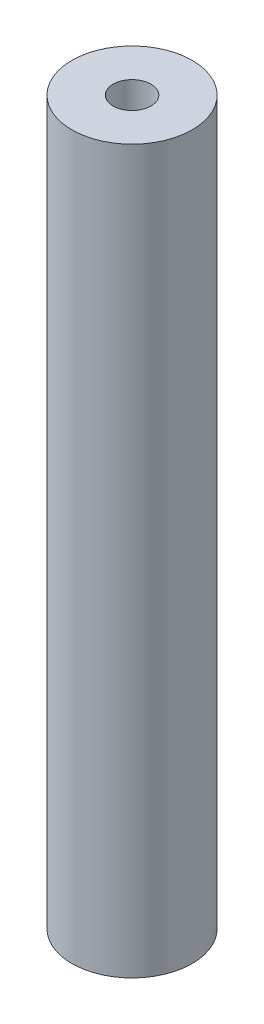
ISO-10303-21;
HEADER;
FILE_DESCRIPTION(('STEP AP214'),'2;1');
FILE_NAME('part.step','',(''),(''),'','','');
FILE_SCHEMA(('AUTOMOTIVE_DESIGN { 1 0 10303 214 1 1 1 1 }'));
ENDSEC;
DATA;
#1=APPLICATION_CONTEXT('core data for automotive mechanical design processes');
#2=APPLICATION_PROTOCOL_DEFINITION('international standard','automotive_design',2000,#1);
#3=PRODUCT_CONTEXT('',#1,'mechanical');
#4=PRODUCT('Part','Part','',(#3));
#5=PRODUCT_RELATED_PRODUCT_CATEGORY('part','',(#4));
#6=PRODUCT_DEFINITION_FORMATION('','',#4);
#7=PRODUCT_DEFINITION_CONTEXT('part definition',#1,'design');
#8=PRODUCT_DEFINITION('design','',#6,#7);
#9=PRODUCT_DEFINITION_SHAPE('','',#8);
#10=(LENGTH_UNIT() NAMED_UNIT(*) SI_UNIT(.MILLI.,.METRE.));
#11=(NAMED_UNIT(*) PLANE_ANGLE_UNIT() SI_UNIT($,.RADIAN.));
#12=(NAMED_UNIT(*) SI_UNIT($,.STERADIAN.) SOLID_ANGLE_UNIT());
#13=UNCERTAINTY_MEASURE_WITH_UNIT(LENGTH_MEASURE(1.E-05),#10,'distance_accuracy_value','');
#14=(GEOMETRIC_REPRESENTATION_CONTEXT(3) GLOBAL_UNCERTAINTY_ASSIGNED_CONTEXT((#13)) GLOBAL_UNIT_ASSIGNED_CONTEXT((#10,
#11,#12)) REPRESENTATION_CONTEXT('',''));
#15=CARTESIAN_POINT('',(0.,0.,0.));
#16=DIRECTION('',(0.,0.,1.));
#17=DIRECTION('',(1.,0.,0.));
#18=AXIS2_PLACEMENT_3D('',#15,#16,#17);
#19=CARTESIAN_POINT('',(0.,76.2,0.));
#20=DIRECTION('',(0.,-1.,0.));
#21=DIRECTION('',(0.,0.,-1.));
#22=AXIS2_PLACEMENT_3D('',#19,#20,#21);
#23=CYLINDRICAL_SURFACE('',#22,6.35);
#24=CARTESIAN_POINT('',(0.,76.2,0.));
#25=DIRECTION('',(0.,1.,0.));
#26=DIRECTION('',(0.,0.,1.));
#27=AXIS2_PLACEMENT_3D('',#24,#25,#26);
#28=CIRCLE('',#27,6.35);
#29=CARTESIAN_POINT('',(0.,76.2,-6.35));
#30=VERTEX_POINT('',#29);
#31=EDGE_CURVE('E10',#30,#30,#28,.T.);
#32=CARTESIAN_POINT('',(0.,0.,0.));
#33=DIRECTION('',(0.,1.,0.));
#34=DIRECTION('',(0.,0.,1.));
#35=AXIS2_PLACEMENT_3D('',#32,#33,#34);
#36=CIRCLE('',#35,6.35);
#37=CARTESIAN_POINT('',(0.,0.,-6.35));
#38=VERTEX_POINT('',#37);
#39=EDGE_CURVE('E40',#38,#38,#36,.T.);
#40=CARTESIAN_POINT('',(0.,76.2,-6.35));
#41=CARTESIAN_POINT('',(0.,75.40625,-6.35));
#42=CARTESIAN_POINT('',(0.,74.6125,-6.35));
#43=CARTESIAN_POINT('',(0.,73.025,-6.35));
#44=CARTESIAN_POINT('',(0.,72.23125,-6.35));
#45=CARTESIAN_POINT('',(0.,70.64375,-6.35));
#46=CARTESIAN_POINT('',(0.,69.85,-6.35));
#47=CARTESIAN_POINT('',(0.,68.2625,-6.35));
#48=CARTESIAN_POINT('',(0.,67.46875,-6.35));
#49=CARTESIAN_POINT('',(0.,65.88125,-6.35));
#50=CARTESIAN_POINT('',(0.,65.0875,-6.35));
#51=CARTESIAN_POINT('',(0.,63.5,-6.35));
#52=CARTESIAN_POINT('',(0.,62.70625,-6.35));
#53=CARTESIAN_POINT('',(0.,61.11875,-6.35));
#54=CARTESIAN_POINT('',(0.,60.325,-6.35));
#55=CARTESIAN_POINT('',(0.,58.7375,-6.35));
#56=CARTESIAN_POINT('',(0.,57.94375,-6.35));
#57=CARTESIAN_POINT('',(0.,56.35625,-6.35));
#58=CARTESIAN_POINT('',(0.,55.5625,-6.35));
#59=CARTESIAN_POINT('',(0.,53.975,-6.35));
#60=CARTESIAN_POINT('',(0.,53.18125,-6.35));
#61=CARTESIAN_POINT('',(0.,51.59375,-6.35));
#62=CARTESIAN_POINT('',(0.,50.8,-6.35));
#63=CARTESIAN_POINT('',(0.,49.2125,-6.35));
#64=CARTESIAN_POINT('',(0.,48.41875,-6.35));
#65=CARTESIAN_POINT('',(0.,46.83125,-6.35));
#66=CARTESIAN_POINT('',(0.,46.0375,-6.35));
#67=CARTESIAN_POINT('',(0.,44.45,-6.35));
#68=CARTESIAN_POINT('',(0.,43.65625,-6.35));
#69=CARTESIAN_POINT('',(0.,42.06875,-6.35));
#70=CARTESIAN_POINT('',(0.,41.275,-6.35));
#71=CARTESIAN_POINT('',(0.,39.6875,-6.35));
#72=CARTESIAN_POINT('',(0.,38.89375,-6.35));
#73=CARTESIAN_POINT('',(0.,37.30625,-6.35));
#74=CARTESIAN_POINT('',(0.,36.5125,-6.35));
#75=CARTESIAN_POINT('',(0.,34.925,-6.35));
#76=CARTESIAN_POINT('',(0.,34.13125,-6.35));
#77=CARTESIAN_POINT('',(0.,32.54375,-6.35));
#78=CARTESIAN_POINT('',(0.,31.75,-6.35));
#79=CARTESIAN_POINT('',(0.,30.1625,-6.35));
#80=CARTESIAN_POINT('',(0.,29.36875,-6.35));
#81=CARTESIAN_POINT('',(0.,27.78125,-6.35));
#82=CARTESIAN_POINT('',(0.,26.9875,-6.35));
#83=CARTESIAN_POINT('',(0.,25.4,-6.35));
#84=CARTESIAN_POINT('',(0.,24.60625,-6.35));
#85=CARTESIAN_POINT('',(0.,23.01875,-6.35));
#86=CARTESIAN_POINT('',(0.,22.225,-6.35));
#87=CARTESIAN_POINT('',(0.,20.6375,-6.35));
#88=CARTESIAN_POINT('',(0.,19.84375,-6.35));
#89=CARTESIAN_POINT('',(0.,18.25625,-6.35));
#90=CARTESIAN_POINT('',(0.,17.4625,-6.35));
#91=CARTESIAN_POINT('',(0.,15.875,-6.35));
#92=CARTESIAN_POINT('',(0.,15.08125,-6.35));
#93=CARTESIAN_POINT('',(0.,13.49375,-6.35));
#94=CARTESIAN_POINT('',(0.,12.7,-6.35));
#95=CARTESIAN_POINT('',(0.,11.1125,-6.35));
#96=CARTESIAN_POINT('',(0.,10.31875,-6.35));
#97=CARTESIAN_POINT('',(0.,8.73125,-6.35));
#98=CARTESIAN_POINT('',(0.,7.93750000000001,-6.35));
#99=CARTESIAN_POINT('',(0.,6.35,-6.35));
#100=CARTESIAN_POINT('',(0.,5.55625,-6.35));
#101=CARTESIAN_POINT('',(0.,3.96875,-6.35));
#102=CARTESIAN_POINT('',(0.,3.175,-6.35));
#103=CARTESIAN_POINT('',(0.,1.5875,-6.35));
#104=CARTESIAN_POINT('',(0.,0.793750000000001,-6.35));
#105=CARTESIAN_POINT('',(0.,0.,-6.35));
#106=B_SPLINE_CURVE_WITH_KNOTS('',3,(#40,#41,#42,#43,#44,#45,#46,#47,#48,#49,#50,#51,#52,#53,
#54,#55,#56,#57,#58,#59,#60,#61,#62,#63,#64,#65,#66,#67,#68,#69,#70,#71,#72,#73,#74,#75,#76,#77,
#78,#79,#80,#81,#82,#83,#84,#85,#86,#87,#88,#89,#90,#91,#92,#93,#94,#95,#96,#97,#98,#99,#100,
#101,#102,#103,#104,#105),.UNSPECIFIED.,.F.,.F.,(4,2,2,2,2,2,2,2,2,2,2,2,2,2,2,2,2,2,2,2,2,2,2,
2,2,2,2,2,2,2,2,2,4),(0.,2.38124999999999,4.76249999999999,7.14374999999999,9.52499999999999,
11.90625,14.2875,16.66875,19.05,21.43125,23.8125,26.19375,28.575,30.95625,33.3375,35.71875,38.1,
40.48125,42.8625,45.24375,47.625,50.00625,52.3875,54.76875,57.15,59.53125,61.9125,64.29375,
66.675,69.05625,71.4375,73.81875,76.2),.UNSPECIFIED.);
#107=EDGE_CURVE('BSEAM37',#30,#38,#106,.T.);
#108=ORIENTED_EDGE('',*,*,#31,.F.);
#109=ORIENTED_EDGE('',*,*,#39,.T.);
#110=ORIENTED_EDGE('',*,*,#107,.T.);
#111=ORIENTED_EDGE('',*,*,#107,.F.);
#112=EDGE_LOOP('',(#108,#110,#109,#111));
#113=FACE_BOUND('',#112,.T.);
#114=ADVANCED_FACE('F37',(#113),#23,.T.);
#115=CARTESIAN_POINT('',(0.,76.2,0.));
#116=DIRECTION('',(0.,1.,0.));
#117=DIRECTION('',(0.,0.,1.));
#118=AXIS2_PLACEMENT_3D('',#115,#116,#117);
#119=PLANE('',#118);
#120=CARTESIAN_POINT('',(0.,76.2,0.));
#121=DIRECTION('',(0.,1.,0.));
#122=DIRECTION('',(0.,0.,1.));
#123=AXIS2_PLACEMENT_3D('',#120,#121,#122);
#124=CIRCLE('',#123,2.);
#125=CARTESIAN_POINT('',(0.,76.2,2.));
#126=VERTEX_POINT('',#125);
#127=EDGE_CURVE('E55',#126,#126,#124,.T.);
#128=ORIENTED_EDGE('',*,*,#127,.F.);
#129=EDGE_LOOP('',(#128));
#130=FACE_BOUND('',#129,.T.);
#131=ORIENTED_EDGE('',*,*,#31,.T.);
#132=EDGE_LOOP('',(#131));
#133=FACE_BOUND('',#132,.T.);
#134=ADVANCED_FACE('F70',(#130,#133),#119,.T.);
#135=CARTESIAN_POINT('',(0.,0.,0.));
#136=DIRECTION('',(0.,1.,0.));
#137=DIRECTION('',(0.,0.,1.));
#138=AXIS2_PLACEMENT_3D('',#135,#136,#137);
#139=PLANE('',#138);
#140=CARTESIAN_POINT('',(0.,0.,0.));
#141=DIRECTION('',(0.,-1.,0.));
#142=DIRECTION('',(0.,0.,-1.));
#143=AXIS2_PLACEMENT_3D('',#140,#141,#142);
#144=CIRCLE('',#143,2.000000064);
#145=CARTESIAN_POINT('',(0.,0.,-2.000000064));
#146=VERTEX_POINT('',#145);
#147=EDGE_CURVE('E49',#146,#146,#144,.T.);
#148=ORIENTED_EDGE('',*,*,#147,.F.);
#149=EDGE_LOOP('',(#148));
#150=FACE_BOUND('',#149,.T.);
#151=ORIENTED_EDGE('',*,*,#39,.F.);
#152=EDGE_LOOP('',(#151));
#153=FACE_BOUND('',#152,.T.);
#154=ADVANCED_FACE('F72',(#150,#153),#139,.F.);
#155=CARTESIAN_POINT('',(0.,6.99999997,0.));
#156=DIRECTION('',(0.,-1.,0.));
#157=DIRECTION('',(0.,0.,-1.));
#158=AXIS2_PLACEMENT_3D('',#155,#156,#157);
#159=CYLINDRICAL_SURFACE('',#158,2.000000064);
#160=CARTESIAN_POINT('',(0.,6.99999997,0.));
#161=DIRECTION('',(0.,-1.,0.));
#162=DIRECTION('',(0.,0.,-1.));
#163=AXIS2_PLACEMENT_3D('',#160,#161,#162);
#164=CIRCLE('',#163,2.000000064);
#165=CARTESIAN_POINT('',(0.,6.99999997,-2.000000064));
#166=VERTEX_POINT('',#165);
#167=EDGE_CURVE('E47',#166,#166,#164,.T.);
#168=ORIENTED_EDGE('',*,*,#167,.F.);
#169=EDGE_LOOP('',(#168));
#170=FACE_BOUND('',#169,.T.);
#171=ORIENTED_EDGE('',*,*,#147,.T.);
#172=EDGE_LOOP('',(#171));
#173=FACE_BOUND('',#172,.T.);
#174=ADVANCED_FACE('F78',(#170,#173),#159,.F.);
#175=CARTESIAN_POINT('',(0.,6.99999997,0.));
#176=DIRECTION('',(0.,-1.,0.));
#177=DIRECTION('',(0.,0.,-1.));
#178=AXIS2_PLACEMENT_3D('',#175,#176,#177);
#179=PLANE('',#178);
#180=ORIENTED_EDGE('',*,*,#167,.T.);
#181=EDGE_LOOP('',(#180));
#182=FACE_BOUND('',#181,.T.);
#183=ADVANCED_FACE('F66',(#182),#179,.T.);
#184=CARTESIAN_POINT('',(0.,69.20000003,0.));
#185=DIRECTION('',(0.,1.,0.));
#186=DIRECTION('',(0.,0.,1.));
#187=AXIS2_PLACEMENT_3D('',#184,#185,#186);
#188=CYLINDRICAL_SURFACE('',#187,2.);
#189=CARTESIAN_POINT('',(0.,69.20000003,0.));
#190=DIRECTION('',(0.,1.,0.));
#191=DIRECTION('',(0.,0.,1.));
#192=AXIS2_PLACEMENT_3D('',#189,#190,#191);
#193=CIRCLE('',#192,2.);
#194=CARTESIAN_POINT('',(0.,69.20000003,2.));
#195=VERTEX_POINT('',#194);
#196=EDGE_CURVE('E52',#195,#195,#193,.T.);
#197=ORIENTED_EDGE('',*,*,#196,.F.);
#198=EDGE_LOOP('',(#197));
#199=FACE_BOUND('',#198,.T.);
#200=ORIENTED_EDGE('',*,*,#127,.T.);
#201=EDGE_LOOP('',(#200));
#202=FACE_BOUND('',#201,.T.);
#203=ADVANCED_FACE('F63',(#199,#202),#188,.F.);
#204=CARTESIAN_POINT('',(0.,69.20000003,0.));
#205=DIRECTION('',(0.,1.,0.));
#206=DIRECTION('',(0.,0.,1.));
#207=AXIS2_PLACEMENT_3D('',#204,#205,#206);
#208=PLANE('',#207);
#209=ORIENTED_EDGE('',*,*,#196,.T.);
#210=EDGE_LOOP('',(#209));
#211=FACE_BOUND('',#210,.T.);
#212=ADVANCED_FACE('F61',(#211),#208,.T.);
#213=CLOSED_SHELL('',(#114,#134,#154,#174,#183,#203,#212));
#214=MANIFOLD_SOLID_BREP('B2',#213);
#215=ADVANCED_BREP_SHAPE_REPRESENTATION('',(#18,#214),#14);
#216=SHAPE_DEFINITION_REPRESENTATION(#9,#215);
ENDSEC;
END-ISO-10303-21;
